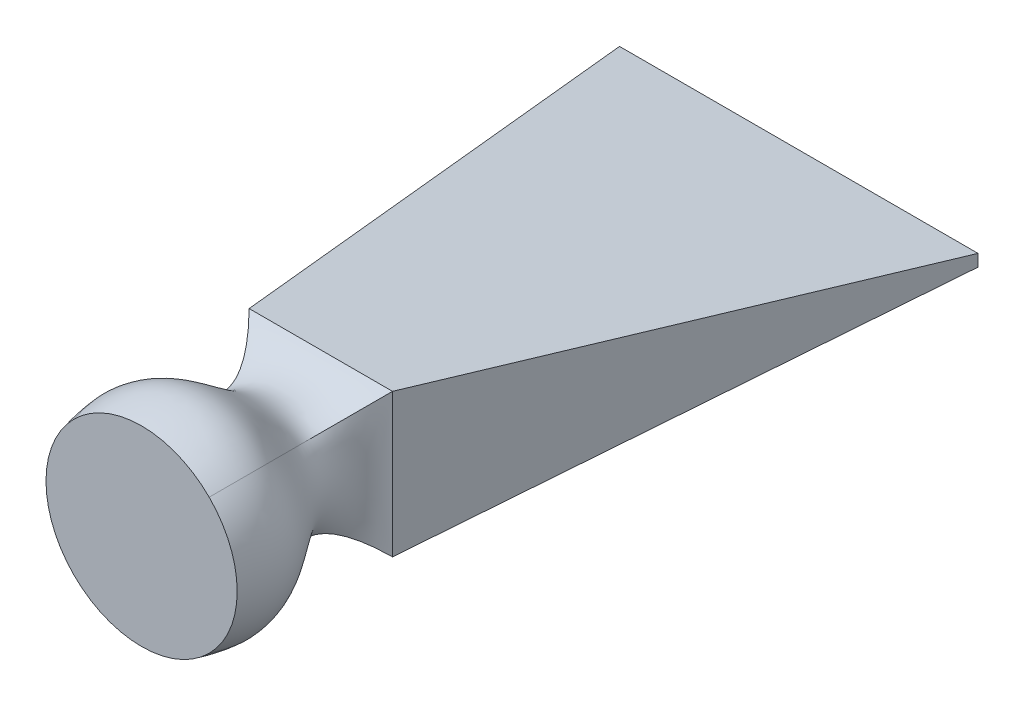
ISO-10303-21;
HEADER;
FILE_DESCRIPTION(('STEP AP214'),'2;1');
FILE_NAME('part.step','',(''),(''),'','','');
FILE_SCHEMA(('AUTOMOTIVE_DESIGN { 1 0 10303 214 1 1 1 1 }'));
ENDSEC;
DATA;
#1=APPLICATION_CONTEXT('core data for automotive mechanical design processes');
#2=APPLICATION_PROTOCOL_DEFINITION('international standard','automotive_design',2000,#1);
#3=PRODUCT_CONTEXT('',#1,'mechanical');
#4=PRODUCT('Part','Part','',(#3));
#5=PRODUCT_RELATED_PRODUCT_CATEGORY('part','',(#4));
#6=PRODUCT_DEFINITION_FORMATION('','',#4);
#7=PRODUCT_DEFINITION_CONTEXT('part definition',#1,'design');
#8=PRODUCT_DEFINITION('design','',#6,#7);
#9=PRODUCT_DEFINITION_SHAPE('','',#8);
#10=(LENGTH_UNIT() NAMED_UNIT(*) SI_UNIT(.MILLI.,.METRE.));
#11=(NAMED_UNIT(*) PLANE_ANGLE_UNIT() SI_UNIT($,.RADIAN.));
#12=(NAMED_UNIT(*) SI_UNIT($,.STERADIAN.) SOLID_ANGLE_UNIT());
#13=UNCERTAINTY_MEASURE_WITH_UNIT(LENGTH_MEASURE(1.E-05),#10,'distance_accuracy_value','');
#14=(GEOMETRIC_REPRESENTATION_CONTEXT(3) GLOBAL_UNCERTAINTY_ASSIGNED_CONTEXT((#13)) GLOBAL_UNIT_ASSIGNED_CONTEXT((#10,
#11,#12)) REPRESENTATION_CONTEXT('',''));
#15=CARTESIAN_POINT('',(0.,0.,0.));
#16=DIRECTION('',(0.,0.,1.));
#17=DIRECTION('',(1.,0.,0.));
#18=AXIS2_PLACEMENT_3D('',#15,#16,#17);
#19=CARTESIAN_POINT('',(0.,0.,75.));
#20=DIRECTION('',(0.,0.,1.));
#21=DIRECTION('',(1.,0.,0.));
#22=AXIS2_PLACEMENT_3D('',#19,#20,#21);
#23=PLANE('',#22);
#24=CARTESIAN_POINT('',(0.,0.,75.));
#25=DIRECTION('',(0.,0.,1.));
#26=DIRECTION('',(1.,0.,0.));
#27=AXIS2_PLACEMENT_3D('',#24,#25,#26);
#28=CIRCLE('',#27,40.);
#29=CARTESIAN_POINT('',(-28.2842712474619,28.2842712474619,75.));
#30=VERTEX_POINT('',#29);
#31=CARTESIAN_POINT('',(-28.2842712474619,-28.2842712474619,75.));
#32=VERTEX_POINT('',#31);
#33=EDGE_CURVE('E12',#30,#32,#28,.T.);
#34=ORIENTED_EDGE('',*,*,#33,.T.);
#35=CARTESIAN_POINT('',(28.2842712474619,-28.2842712474619,75.));
#36=VERTEX_POINT('',#35);
#37=EDGE_CURVE('E83',#32,#36,#28,.T.);
#38=ORIENTED_EDGE('',*,*,#37,.T.);
#39=CARTESIAN_POINT('',(28.2842712474619,28.2842712474619,75.));
#40=VERTEX_POINT('',#39);
#41=EDGE_CURVE('E412',#36,#40,#28,.T.);
#42=ORIENTED_EDGE('',*,*,#41,.T.);
#43=EDGE_CURVE('E357',#40,#30,#28,.T.);
#44=ORIENTED_EDGE('',*,*,#43,.T.);
#45=EDGE_LOOP('',(#34,#38,#42,#44));
#46=FACE_BOUND('',#45,.T.);
#47=ADVANCED_FACE('F74',(#46),#23,.T.);
#48=CARTESIAN_POINT('',(-30.,-30.,0.));
#49=CARTESIAN_POINT('',(-22.0800461978646,-22.0800461978646,8.07168399086587));
#50=CARTESIAN_POINT('',(-11.6307533816279,-11.6307533816279,26.0595277475374));
#51=CARTESIAN_POINT('',(-31.5666511592213,-31.5666511592213,47.7752740896841));
#52=CARTESIAN_POINT('',(-29.9060757914677,-29.9060757914677,65.9785932721713));
#53=CARTESIAN_POINT('',(-28.2842712474619,-28.2842712474619,75.));
#54=CARTESIAN_POINT('',(-10.,-30.,0.));
#55=CARTESIAN_POINT('',(-7.36001539928819,-22.0800461978646,8.07168399086587));
#56=CARTESIAN_POINT('',(-6.42260808745875,-23.8746261370654,26.0595277475374));
#57=CARTESIAN_POINT('',(-13.9405301891043,-48.0075321184264,47.7752740896841));
#58=CARTESIAN_POINT('',(-13.2143589159199,-45.5165896376783,65.9785932721713));
#59=CARTESIAN_POINT('',(-12.6737574012513,-43.8947850936725,75.));
#60=CARTESIAN_POINT('',(10.,-30.,0.));
#61=CARTESIAN_POINT('',(7.36001539928819,-22.0800461978646,8.07168399086587));
#62=CARTESIAN_POINT('',(6.42260808745874,-23.8746261370654,26.0595277475374));
#63=CARTESIAN_POINT('',(13.9405301891043,-48.0075321184264,47.7752740896841));
#64=CARTESIAN_POINT('',(13.2143589159199,-45.5165896376783,65.9785932721713));
#65=CARTESIAN_POINT('',(12.6737574012513,-43.8947850936725,75.));
#66=CARTESIAN_POINT('',(30.,-30.,0.));
#67=CARTESIAN_POINT('',(22.0800461978646,-22.0800461978646,8.07168399086587));
#68=CARTESIAN_POINT('',(11.6307533816279,-11.6307533816279,26.0595277475374));
#69=CARTESIAN_POINT('',(31.5666511592213,-31.5666511592213,47.7752740896841));
#70=CARTESIAN_POINT('',(29.9060757914677,-29.9060757914677,65.9785932721713));
#71=CARTESIAN_POINT('',(28.2842712474619,-28.2842712474619,75.));
#72=B_SPLINE_SURFACE_WITH_KNOTS('',3,3,((#48,#49,#50,#51,#52,#53),(#54,#55,#56,#57,#58,#59),
(#60,#61,#62,#63,#64,#65),(#66,#67,#68,#69,#70,#71)),.UNSPECIFIED.,.F.,.F.,.F.,(4,4),(4,1,1,4),
(0.,1.),(0.,0.340697169263658,0.69563947973487,1.),.UNSPECIFIED.);
#73=DIRECTION('',(1.,0.,0.));
#74=VECTOR('',#73,1.);
#75=CARTESIAN_POINT('',(-30.,-30.,0.));
#76=LINE('',#75,#74);
#77=CARTESIAN_POINT('',(-30.,-30.,0.));
#78=VERTEX_POINT('',#77);
#79=CARTESIAN_POINT('',(30.,-30.,0.));
#80=VERTEX_POINT('',#79);
#81=EDGE_CURVE('E393',#78,#80,#76,.T.);
#82=CARTESIAN_POINT('',(30.,-30.,0.));
#83=CARTESIAN_POINT('',(22.0800461978646,-22.0800461978646,8.07168399086587));
#84=CARTESIAN_POINT('',(11.6307533816279,-11.6307533816279,26.0595277475374));
#85=CARTESIAN_POINT('',(31.5666511592213,-31.5666511592213,47.7752740896841));
#86=CARTESIAN_POINT('',(29.9060757914677,-29.9060757914677,65.9785932721713));
#87=CARTESIAN_POINT('',(28.2842712474619,-28.2842712474619,75.));
#88=B_SPLINE_CURVE_WITH_KNOTS('',3,(#82,#83,#84,#85,#86,#87),.UNSPECIFIED.,.F.,.F.,(4,1,1,4),
(0.,0.340697169263658,0.69563947973487,1.),.UNSPECIFIED.);
#89=EDGE_CURVE('E377',#80,#36,#88,.T.);
#90=CARTESIAN_POINT('',(-30.,-30.,0.));
#91=CARTESIAN_POINT('',(-22.0800461978646,-22.0800461978646,8.07168399086587));
#92=CARTESIAN_POINT('',(-11.6307533816279,-11.6307533816279,26.0595277475374));
#93=CARTESIAN_POINT('',(-31.5666511592213,-31.5666511592213,47.7752740896841));
#94=CARTESIAN_POINT('',(-29.9060757914677,-29.9060757914677,65.9785932721713));
#95=CARTESIAN_POINT('',(-28.2842712474619,-28.2842712474619,75.));
#96=B_SPLINE_CURVE_WITH_KNOTS('',3,(#90,#91,#92,#93,#94,#95),.UNSPECIFIED.,.F.,.F.,(4,1,1,4),
(0.,0.340697169263658,0.69563947973487,1.),.UNSPECIFIED.);
#97=EDGE_CURVE('E234',#32,#78,#96,.F.);
#98=ORIENTED_EDGE('',*,*,#81,.T.);
#99=ORIENTED_EDGE('',*,*,#89,.T.);
#100=ORIENTED_EDGE('',*,*,#37,.F.);
#101=ORIENTED_EDGE('',*,*,#97,.T.);
#102=EDGE_LOOP('',(#98,#99,#100,#101));
#103=FACE_BOUND('',#102,.T.);
#104=ADVANCED_FACE('F281',(#103),#72,.T.);
#105=CARTESIAN_POINT('',(30.,-30.,0.));
#106=CARTESIAN_POINT('',(22.0800461978646,-22.0800461978646,8.07168399086587));
#107=CARTESIAN_POINT('',(11.6307533816279,-11.6307533816279,26.0595277475374));
#108=CARTESIAN_POINT('',(31.5666511592213,-31.5666511592213,47.7752740896841));
#109=CARTESIAN_POINT('',(29.9060757914677,-29.9060757914677,65.9785932721713));
#110=CARTESIAN_POINT('',(28.2842712474619,-28.2842712474619,75.));
#111=CARTESIAN_POINT('',(30.,-10.,0.));
#112=CARTESIAN_POINT('',(22.0800461978646,-7.36001539928819,8.07168399086587));
#113=CARTESIAN_POINT('',(23.8746261370654,-6.42260808745875,26.0595277475374));
#114=CARTESIAN_POINT('',(48.0075321184264,-13.9405301891043,47.7752740896841));
#115=CARTESIAN_POINT('',(45.5165896376783,-13.2143589159199,65.9785932721713));
#116=CARTESIAN_POINT('',(43.8947850936725,-12.6737574012513,75.));
#117=CARTESIAN_POINT('',(30.,10.,0.));
#118=CARTESIAN_POINT('',(22.0800461978646,7.36001539928818,8.07168399086587));
#119=CARTESIAN_POINT('',(23.8746261370654,6.42260808745874,26.0595277475374));
#120=CARTESIAN_POINT('',(48.0075321184264,13.9405301891043,47.7752740896841));
#121=CARTESIAN_POINT('',(45.5165896376783,13.2143589159199,65.9785932721713));
#122=CARTESIAN_POINT('',(43.8947850936725,12.6737574012513,75.));
#123=CARTESIAN_POINT('',(30.,30.,0.));
#124=CARTESIAN_POINT('',(22.0800461978646,22.0800461978646,8.07168399086587));
#125=CARTESIAN_POINT('',(11.6307533816279,11.6307533816279,26.0595277475374));
#126=CARTESIAN_POINT('',(31.5666511592213,31.5666511592213,47.7752740896841));
#127=CARTESIAN_POINT('',(29.9060757914677,29.9060757914677,65.9785932721713));
#128=CARTESIAN_POINT('',(28.2842712474619,28.2842712474619,75.));
#129=B_SPLINE_SURFACE_WITH_KNOTS('',3,3,((#105,#106,#107,#108,#109,#110),(#111,#112,#113,#114,
#115,#116),(#117,#118,#119,#120,#121,#122),(#123,#124,#125,#126,#127,#128)),.UNSPECIFIED.,.F.,
.F.,.F.,(4,4),(4,1,1,4),(0.,1.),(0.,0.340697169263658,0.69563947973487,1.),.UNSPECIFIED.);
#130=DIRECTION('',(0.,1.,0.));
#131=VECTOR('',#130,1.);
#132=CARTESIAN_POINT('',(30.,-30.,0.));
#133=LINE('',#132,#131);
#134=CARTESIAN_POINT('',(30.,30.,0.));
#135=VERTEX_POINT('',#134);
#136=EDGE_CURVE('E161',#80,#135,#133,.T.);
#137=CARTESIAN_POINT('',(30.,30.,0.));
#138=CARTESIAN_POINT('',(22.0800461978646,22.0800461978646,8.07168399086587));
#139=CARTESIAN_POINT('',(11.6307533816279,11.6307533816279,26.0595277475374));
#140=CARTESIAN_POINT('',(31.5666511592213,31.5666511592213,47.7752740896841));
#141=CARTESIAN_POINT('',(29.9060757914677,29.9060757914677,65.9785932721713));
#142=CARTESIAN_POINT('',(28.2842712474619,28.2842712474619,75.));
#143=B_SPLINE_CURVE_WITH_KNOTS('',3,(#137,#138,#139,#140,#141,#142),.UNSPECIFIED.,.F.,.F.,(4,1,
1,4),(0.,0.340697169263658,0.69563947973487,1.),.UNSPECIFIED.);
#144=EDGE_CURVE('E368',#135,#40,#143,.T.);
#145=ORIENTED_EDGE('',*,*,#136,.T.);
#146=ORIENTED_EDGE('',*,*,#144,.T.);
#147=ORIENTED_EDGE('',*,*,#41,.F.);
#148=ORIENTED_EDGE('',*,*,#89,.F.);
#149=EDGE_LOOP('',(#145,#146,#147,#148));
#150=FACE_BOUND('',#149,.T.);
#151=ADVANCED_FACE('F285',(#150),#129,.T.);
#152=CARTESIAN_POINT('',(-30.,30.,0.));
#153=CARTESIAN_POINT('',(-22.0800461978646,22.0800461978646,8.07168399086587));
#154=CARTESIAN_POINT('',(-11.6307533816279,11.630753381628,26.0595277475374));
#155=CARTESIAN_POINT('',(-31.5666511592213,31.5666511592213,47.7752740896841));
#156=CARTESIAN_POINT('',(-29.9060757914677,29.9060757914677,65.9785932721713));
#157=CARTESIAN_POINT('',(-28.2842712474619,28.2842712474619,75.));
#158=CARTESIAN_POINT('',(-30.,10.,0.));
#159=CARTESIAN_POINT('',(-22.0800461978646,7.36001539928818,8.07168399086587));
#160=CARTESIAN_POINT('',(-23.8746261370654,6.42260808745875,26.0595277475374));
#161=CARTESIAN_POINT('',(-48.0075321184264,13.9405301891043,47.7752740896841));
#162=CARTESIAN_POINT('',(-45.5165896376783,13.2143589159199,65.9785932721713));
#163=CARTESIAN_POINT('',(-43.8947850936725,12.6737574012513,75.));
#164=CARTESIAN_POINT('',(-30.,-10.,0.));
#165=CARTESIAN_POINT('',(-22.0800461978646,-7.36001539928819,8.07168399086587));
#166=CARTESIAN_POINT('',(-23.8746261370654,-6.42260808745874,26.0595277475374));
#167=CARTESIAN_POINT('',(-48.0075321184264,-13.9405301891043,47.7752740896841));
#168=CARTESIAN_POINT('',(-45.5165896376783,-13.2143589159199,65.9785932721713));
#169=CARTESIAN_POINT('',(-43.8947850936725,-12.6737574012513,75.));
#170=CARTESIAN_POINT('',(-30.,-30.,0.));
#171=CARTESIAN_POINT('',(-22.0800461978646,-22.0800461978646,8.07168399086587));
#172=CARTESIAN_POINT('',(-11.630753381628,-11.6307533816279,26.0595277475374));
#173=CARTESIAN_POINT('',(-31.5666511592213,-31.5666511592213,47.7752740896841));
#174=CARTESIAN_POINT('',(-29.9060757914677,-29.9060757914677,65.9785932721713));
#175=CARTESIAN_POINT('',(-28.2842712474619,-28.2842712474619,75.));
#176=B_SPLINE_SURFACE_WITH_KNOTS('',3,3,((#152,#153,#154,#155,#156,#157),(#158,#159,#160,#161,
#162,#163),(#164,#165,#166,#167,#168,#169),(#170,#171,#172,#173,#174,#175)),.UNSPECIFIED.,.F.,
.F.,.F.,(4,4),(4,1,1,4),(0.,1.),(0.,0.340697169263658,0.69563947973487,1.),.UNSPECIFIED.);
#177=DIRECTION('',(0.,-1.,0.));
#178=VECTOR('',#177,1.);
#179=CARTESIAN_POINT('',(-30.,-30.,0.));
#180=LINE('',#179,#178);
#181=CARTESIAN_POINT('',(-30.,30.,0.));
#182=VERTEX_POINT('',#181);
#183=EDGE_CURVE('E159',#182,#78,#180,.T.);
#184=CARTESIAN_POINT('',(-30.,30.,0.));
#185=CARTESIAN_POINT('',(-22.0800461978646,22.0800461978646,8.07168399086587));
#186=CARTESIAN_POINT('',(-11.630753381628,11.630753381628,26.0595277475374));
#187=CARTESIAN_POINT('',(-31.5666511592213,31.5666511592213,47.7752740896841));
#188=CARTESIAN_POINT('',(-29.9060757914677,29.9060757914677,65.9785932721713));
#189=CARTESIAN_POINT('',(-28.2842712474619,28.2842712474619,75.));
#190=B_SPLINE_CURVE_WITH_KNOTS('',3,(#184,#185,#186,#187,#188,#189),.UNSPECIFIED.,.F.,.F.,(4,1,
1,4),(0.,0.340697169263658,0.69563947973487,1.),.UNSPECIFIED.);
#191=EDGE_CURVE('E363',#182,#30,#190,.T.);
#192=ORIENTED_EDGE('',*,*,#183,.T.);
#193=ORIENTED_EDGE('',*,*,#97,.F.);
#194=ORIENTED_EDGE('',*,*,#33,.F.);
#195=ORIENTED_EDGE('',*,*,#191,.F.);
#196=EDGE_LOOP('',(#192,#193,#194,#195));
#197=FACE_BOUND('',#196,.T.);
#198=ADVANCED_FACE('F278',(#197),#176,.T.);
#199=CARTESIAN_POINT('',(30.,30.,0.));
#200=CARTESIAN_POINT('',(22.0800461978646,22.0800461978646,8.07168399086587));
#201=CARTESIAN_POINT('',(11.630753381628,11.630753381628,26.0595277475374));
#202=CARTESIAN_POINT('',(31.5666511592213,31.5666511592213,47.7752740896841));
#203=CARTESIAN_POINT('',(29.9060757914677,29.9060757914677,65.9785932721713));
#204=CARTESIAN_POINT('',(28.2842712474619,28.2842712474619,75.));
#205=CARTESIAN_POINT('',(10.,30.,0.));
#206=CARTESIAN_POINT('',(7.36001539928819,22.0800461978646,8.07168399086587));
#207=CARTESIAN_POINT('',(6.42260808745875,23.8746261370654,26.0595277475374));
#208=CARTESIAN_POINT('',(13.9405301891043,48.0075321184264,47.7752740896841));
#209=CARTESIAN_POINT('',(13.2143589159199,45.5165896376783,65.9785932721713));
#210=CARTESIAN_POINT('',(12.6737574012513,43.8947850936725,75.));
#211=CARTESIAN_POINT('',(-10.,30.,0.));
#212=CARTESIAN_POINT('',(-7.36001539928819,22.0800461978646,8.07168399086587));
#213=CARTESIAN_POINT('',(-6.42260808745875,23.8746261370654,26.0595277475374));
#214=CARTESIAN_POINT('',(-13.9405301891043,48.0075321184264,47.7752740896841));
#215=CARTESIAN_POINT('',(-13.2143589159199,45.5165896376783,65.9785932721713));
#216=CARTESIAN_POINT('',(-12.6737574012513,43.8947850936725,75.));
#217=CARTESIAN_POINT('',(-30.,30.,0.));
#218=CARTESIAN_POINT('',(-22.0800461978646,22.0800461978646,8.07168399086587));
#219=CARTESIAN_POINT('',(-11.630753381628,11.630753381628,26.0595277475374));
#220=CARTESIAN_POINT('',(-31.5666511592213,31.5666511592213,47.7752740896841));
#221=CARTESIAN_POINT('',(-29.9060757914677,29.9060757914677,65.9785932721713));
#222=CARTESIAN_POINT('',(-28.2842712474619,28.2842712474619,75.));
#223=B_SPLINE_SURFACE_WITH_KNOTS('',3,3,((#199,#200,#201,#202,#203,#204),(#205,#206,#207,#208,
#209,#210),(#211,#212,#213,#214,#215,#216),(#217,#218,#219,#220,#221,#222)),.UNSPECIFIED.,.F.,
.F.,.F.,(4,4),(4,1,1,4),(0.,1.),(0.,0.340697169263658,0.69563947973487,1.),.UNSPECIFIED.);
#224=DIRECTION('',(-1.,0.,0.));
#225=VECTOR('',#224,1.);
#226=CARTESIAN_POINT('',(-30.,30.,0.));
#227=LINE('',#226,#225);
#228=EDGE_CURVE('E164',#135,#182,#227,.T.);
#229=ORIENTED_EDGE('',*,*,#228,.T.);
#230=ORIENTED_EDGE('',*,*,#191,.T.);
#231=ORIENTED_EDGE('',*,*,#43,.F.);
#232=ORIENTED_EDGE('',*,*,#144,.F.);
#233=EDGE_LOOP('',(#229,#230,#231,#232));
#234=FACE_BOUND('',#233,.T.);
#235=ADVANCED_FACE('F243',(#234),#223,.T.);
#236=CARTESIAN_POINT('',(0.,0.,-200.));
#237=DIRECTION('',(0.,0.,-1.));
#238=DIRECTION('',(-1.,0.,0.));
#239=AXIS2_PLACEMENT_3D('',#236,#237,#238);
#240=PLANE('',#239);
#241=DIRECTION('',(0.,1.,0.));
#242=VECTOR('',#241,1.);
#243=CARTESIAN_POINT('',(75.,-2.5,-200.));
#244=LINE('',#243,#242);
#245=CARTESIAN_POINT('',(75.,-2.5,-200.));
#246=VERTEX_POINT('',#245);
#247=CARTESIAN_POINT('',(75.,2.5,-200.));
#248=VERTEX_POINT('',#247);
#249=EDGE_CURVE('E153',#246,#248,#244,.T.);
#250=ORIENTED_EDGE('',*,*,#249,.F.);
#251=DIRECTION('',(1.,0.,0.));
#252=VECTOR('',#251,1.);
#253=CARTESIAN_POINT('',(-75.,-2.5,-200.));
#254=LINE('',#253,#252);
#255=CARTESIAN_POINT('',(-75.,-2.5,-200.));
#256=VERTEX_POINT('',#255);
#257=EDGE_CURVE('E135',#256,#246,#254,.T.);
#258=ORIENTED_EDGE('',*,*,#257,.F.);
#259=DIRECTION('',(0.,-1.,0.));
#260=VECTOR('',#259,1.);
#261=CARTESIAN_POINT('',(-75.,-2.5,-200.));
#262=LINE('',#261,#260);
#263=CARTESIAN_POINT('',(-75.,2.5,-200.));
#264=VERTEX_POINT('',#263);
#265=EDGE_CURVE('E126',#264,#256,#262,.T.);
#266=ORIENTED_EDGE('',*,*,#265,.F.);
#267=DIRECTION('',(-1.,0.,0.));
#268=VECTOR('',#267,1.);
#269=CARTESIAN_POINT('',(-75.,2.5,-200.));
#270=LINE('',#269,#268);
#271=EDGE_CURVE('E131',#248,#264,#270,.T.);
#272=ORIENTED_EDGE('',*,*,#271,.F.);
#273=EDGE_LOOP('',(#250,#258,#266,#272));
#274=FACE_BOUND('',#273,.T.);
#275=ADVANCED_FACE('F130',(#274),#240,.T.);
#276=CARTESIAN_POINT('',(0.,-29.4433369115166,-4.04845882533354));
#277=DIRECTION('',(0.,0.990678839845296,0.136218340478728));
#278=DIRECTION('',(0.,-0.136218340478728,0.990678839845296));
#279=AXIS2_PLACEMENT_3D('',#276,#277,#278);
#280=PLANE('',#279);
#281=DIRECTION('',(-0.217563370783763,-0.132955393256744,0.966948314594504));
#282=VECTOR('',#281,1.);
#283=CARTESIAN_POINT('',(75.,-2.5,-200.));
#284=LINE('',#283,#282);
#285=EDGE_CURVE('E211',#246,#80,#284,.T.);
#286=ORIENTED_EDGE('',*,*,#285,.T.);
#287=ORIENTED_EDGE('',*,*,#81,.F.);
#288=DIRECTION('',(0.217563370783763,-0.132955393256744,0.966948314594504));
#289=VECTOR('',#288,1.);
#290=CARTESIAN_POINT('',(-75.,-2.5,-200.));
#291=LINE('',#290,#289);
#292=EDGE_CURVE('E166',#256,#78,#291,.T.);
#293=ORIENTED_EDGE('',*,*,#292,.F.);
#294=ORIENTED_EDGE('',*,*,#257,.T.);
#295=EDGE_LOOP('',(#286,#287,#293,#294));
#296=FACE_BOUND('',#295,.T.);
#297=ADVANCED_FACE('F190',(#296),#280,.F.);
#298=CARTESIAN_POINT('',(-28.5544318857823,0.,6.42474717430101));
#299=DIRECTION('',(0.975609756097561,0.,-0.219512195121951));
#300=DIRECTION('',(-0.219512195121951,0.,-0.975609756097561));
#301=AXIS2_PLACEMENT_3D('',#298,#299,#300);
#302=PLANE('',#301);
#303=ORIENTED_EDGE('',*,*,#292,.T.);
#304=ORIENTED_EDGE('',*,*,#183,.F.);
#305=DIRECTION('',(0.217563370783763,0.132955393256744,0.966948314594504));
#306=VECTOR('',#305,1.);
#307=CARTESIAN_POINT('',(-75.,2.5,-200.));
#308=LINE('',#307,#306);
#309=EDGE_CURVE('E150',#264,#182,#308,.T.);
#310=ORIENTED_EDGE('',*,*,#309,.F.);
#311=ORIENTED_EDGE('',*,*,#265,.T.);
#312=EDGE_LOOP('',(#303,#304,#310,#311));
#313=FACE_BOUND('',#312,.T.);
#314=ADVANCED_FACE('F157',(#313),#302,.F.);
#315=CARTESIAN_POINT('',(28.5544318857823,0.,6.42474717430101));
#316=DIRECTION('',(-0.975609756097561,0.,-0.219512195121951));
#317=DIRECTION('',(-0.219512195121951,0.,0.975609756097561));
#318=AXIS2_PLACEMENT_3D('',#315,#316,#317);
#319=PLANE('',#318);
#320=DIRECTION('',(-0.217563370783763,0.132955393256744,0.966948314594504));
#321=VECTOR('',#320,1.);
#322=CARTESIAN_POINT('',(75.,2.5,-200.));
#323=LINE('',#322,#321);
#324=EDGE_CURVE('E152',#248,#135,#323,.T.);
#325=ORIENTED_EDGE('',*,*,#324,.T.);
#326=ORIENTED_EDGE('',*,*,#136,.F.);
#327=ORIENTED_EDGE('',*,*,#285,.F.);
#328=ORIENTED_EDGE('',*,*,#249,.T.);
#329=EDGE_LOOP('',(#325,#326,#327,#328));
#330=FACE_BOUND('',#329,.T.);
#331=ADVANCED_FACE('F189',(#330),#319,.F.);
#332=CARTESIAN_POINT('',(0.,29.4433369115166,-4.04845882533354));
#333=DIRECTION('',(0.,-0.990678839845296,0.136218340478728));
#334=DIRECTION('',(0.,-0.136218340478728,-0.990678839845296));
#335=AXIS2_PLACEMENT_3D('',#332,#333,#334);
#336=PLANE('',#335);
#337=ORIENTED_EDGE('',*,*,#309,.T.);
#338=ORIENTED_EDGE('',*,*,#228,.F.);
#339=ORIENTED_EDGE('',*,*,#324,.F.);
#340=ORIENTED_EDGE('',*,*,#271,.T.);
#341=EDGE_LOOP('',(#337,#338,#339,#340));
#342=FACE_BOUND('',#341,.T.);
#343=ADVANCED_FACE('F148',(#342),#336,.F.);
#344=CLOSED_SHELL('',(#47,#104,#151,#198,#235,#275,#297,#314,#331,#343));
#345=MANIFOLD_SOLID_BREP('B2',#344);
#346=ADVANCED_BREP_SHAPE_REPRESENTATION('',(#18,#345),#14);
#347=SHAPE_DEFINITION_REPRESENTATION(#9,#346);
ENDSEC;
END-ISO-10303-21;
